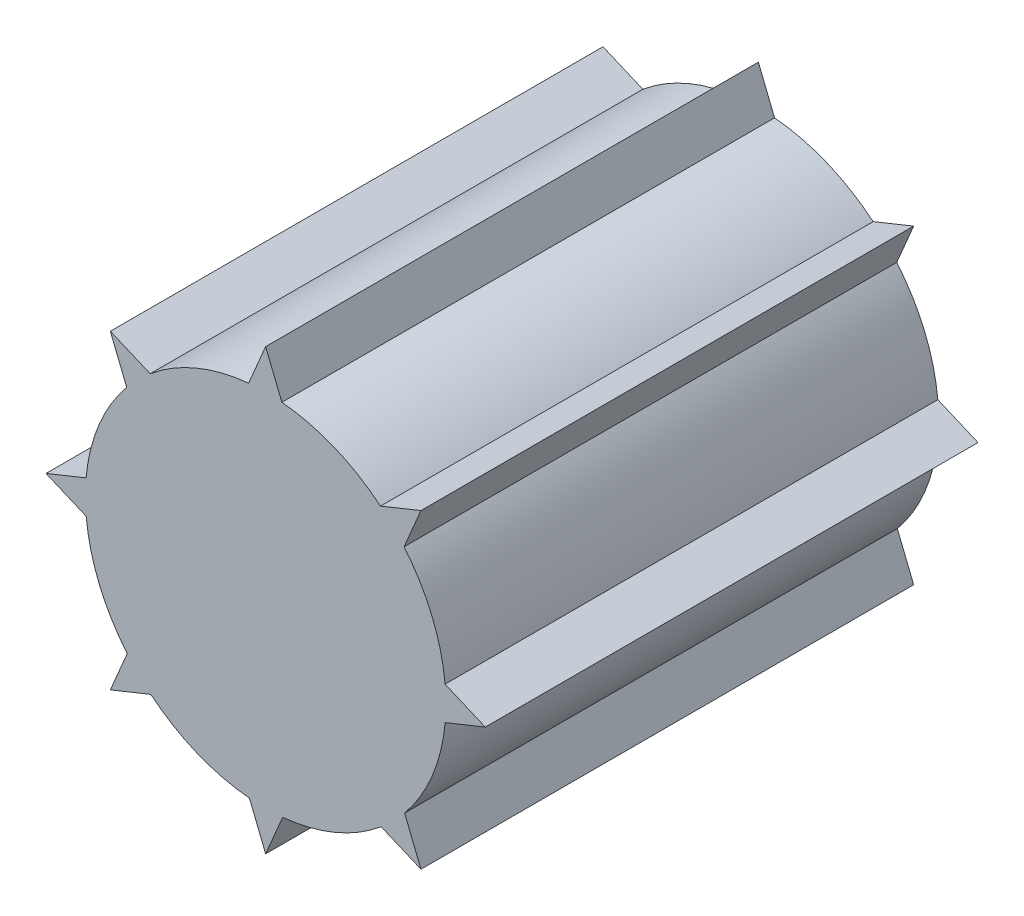
ISO-10303-21;
HEADER;
FILE_DESCRIPTION(('STEP AP214'),'2;1');
FILE_NAME('part.step','',(''),(''),'','','');
FILE_SCHEMA(('AUTOMOTIVE_DESIGN { 1 0 10303 214 1 1 1 1 }'));
ENDSEC;
DATA;
#1=APPLICATION_CONTEXT('core data for automotive mechanical design processes');
#2=APPLICATION_PROTOCOL_DEFINITION('international standard','automotive_design',2000,#1);
#3=PRODUCT_CONTEXT('',#1,'mechanical');
#4=PRODUCT('Part','Part','',(#3));
#5=PRODUCT_RELATED_PRODUCT_CATEGORY('part','',(#4));
#6=PRODUCT_DEFINITION_FORMATION('','',#4);
#7=PRODUCT_DEFINITION_CONTEXT('part definition',#1,'design');
#8=PRODUCT_DEFINITION('design','',#6,#7);
#9=PRODUCT_DEFINITION_SHAPE('','',#8);
#10=(LENGTH_UNIT() NAMED_UNIT(*) SI_UNIT(.MILLI.,.METRE.));
#11=(NAMED_UNIT(*) PLANE_ANGLE_UNIT() SI_UNIT($,.RADIAN.));
#12=(NAMED_UNIT(*) SI_UNIT($,.STERADIAN.) SOLID_ANGLE_UNIT());
#13=UNCERTAINTY_MEASURE_WITH_UNIT(LENGTH_MEASURE(1.E-05),#10,'distance_accuracy_value','');
#14=(GEOMETRIC_REPRESENTATION_CONTEXT(3) GLOBAL_UNCERTAINTY_ASSIGNED_CONTEXT((#13)) GLOBAL_UNIT_ASSIGNED_CONTEXT((#10,
#11,#12)) REPRESENTATION_CONTEXT('',''));
#15=CARTESIAN_POINT('',(0.,0.,0.));
#16=DIRECTION('',(0.,0.,1.));
#17=DIRECTION('',(1.,0.,0.));
#18=AXIS2_PLACEMENT_3D('',#15,#16,#17);
#19=CARTESIAN_POINT('',(0.,0.,85.));
#20=DIRECTION('',(0.,0.,-1.));
#21=DIRECTION('',(-1.,0.,0.));
#22=AXIS2_PLACEMENT_3D('',#19,#20,#21);
#23=CYLINDRICAL_SURFACE('',#22,31.0975229357791);
#24=CARTESIAN_POINT('',(0.,0.,0.));
#25=DIRECTION('',(0.,0.,1.));
#26=DIRECTION('',(1.,0.,0.));
#27=AXIS2_PLACEMENT_3D('',#24,#25,#26);
#28=CIRCLE('',#27,31.0975229357791);
#29=CARTESIAN_POINT('',(-2.94038358851622,30.9581988670803,0.));
#30=VERTEX_POINT('',#29);
#31=CARTESIAN_POINT('',(-19.9210625112819,23.8790117291923,0.));
#32=VERTEX_POINT('',#31);
#33=EDGE_CURVE('E225',#30,#32,#28,.T.);
#34=ORIENTED_EDGE('',*,*,#33,.T.);
#35=DIRECTION('',(0.,0.,-1.));
#36=VECTOR('',#35,1.);
#37=CARTESIAN_POINT('',(-19.9210625112819,23.8790117291923,85.));
#38=LINE('',#37,#36);
#39=CARTESIAN_POINT('',(-19.9210625112819,23.8790117291923,85.));
#40=VERTEX_POINT('',#39);
#41=EDGE_CURVE('E11',#40,#32,#38,.T.);
#42=ORIENTED_EDGE('',*,*,#41,.F.);
#43=CARTESIAN_POINT('',(0.,0.,85.));
#44=DIRECTION('',(0.,0.,1.));
#45=DIRECTION('',(1.,0.,0.));
#46=AXIS2_PLACEMENT_3D('',#43,#44,#45);
#47=CIRCLE('',#46,31.0975229357791);
#48=CARTESIAN_POINT('',(-2.94038358851622,30.9581988670803,85.));
#49=VERTEX_POINT('',#48);
#50=EDGE_CURVE('E271',#49,#40,#47,.T.);
#51=ORIENTED_EDGE('',*,*,#50,.F.);
#52=DIRECTION('',(0.,0.,-1.));
#53=VECTOR('',#52,1.);
#54=CARTESIAN_POINT('',(-2.94038358851622,30.9581988670803,85.));
#55=LINE('',#54,#53);
#56=EDGE_CURVE('E221',#49,#30,#55,.T.);
#57=ORIENTED_EDGE('',*,*,#56,.T.);
#58=EDGE_LOOP('',(#34,#42,#51,#57));
#59=FACE_BOUND('',#58,.T.);
#60=ADVANCED_FACE('F33',(#59),#23,.T.);
#61=CARTESIAN_POINT('',(-26.7934881803067,26.7934881803069,85.));
#62=DIRECTION('',(-0.390425181277966,-0.920634660342564,0.));
#63=DIRECTION('',(0.920634660342564,-0.390425181277966,0.));
#64=AXIS2_PLACEMENT_3D('',#61,#62,#63);
#65=PLANE('',#64);
#66=DIRECTION('',(-0.920634660342564,0.390425181277965,0.));
#67=VECTOR('',#66,1.);
#68=CARTESIAN_POINT('',(-26.7934881803067,26.7934881803069,0.));
#69=LINE('',#68,#67);
#70=CARTESIAN_POINT('',(-26.7934881803067,26.7934881803069,0.));
#71=VERTEX_POINT('',#70);
#72=EDGE_CURVE('E228',#32,#71,#69,.T.);
#73=ORIENTED_EDGE('',*,*,#72,.T.);
#74=DIRECTION('',(0.,0.,-1.));
#75=VECTOR('',#74,1.);
#76=CARTESIAN_POINT('',(-26.7934881803067,26.7934881803069,85.));
#77=LINE('',#76,#75);
#78=CARTESIAN_POINT('',(-26.7934881803067,26.7934881803069,85.));
#79=VERTEX_POINT('',#78);
#80=EDGE_CURVE('E41',#79,#71,#77,.T.);
#81=ORIENTED_EDGE('',*,*,#80,.F.);
#82=DIRECTION('',(-0.920634660342564,0.390425181277965,0.));
#83=VECTOR('',#82,1.);
#84=CARTESIAN_POINT('',(-26.7934881803067,26.7934881803069,85.));
#85=LINE('',#84,#83);
#86=EDGE_CURVE('E140',#40,#79,#85,.T.);
#87=ORIENTED_EDGE('',*,*,#86,.F.);
#88=ORIENTED_EDGE('',*,*,#41,.T.);
#89=EDGE_LOOP('',(#73,#81,#87,#88));
#90=FACE_BOUND('',#89,.T.);
#91=ADVANCED_FACE('F409',(#90),#65,.F.);
#92=CARTESIAN_POINT('',(-23.9699175269631,19.8115871775043,85.));
#93=DIRECTION('',(0.927059304551223,0.374914718096,0.));
#94=DIRECTION('',(-0.374914718096,0.927059304551223,0.));
#95=AXIS2_PLACEMENT_3D('',#92,#93,#94);
#96=PLANE('',#95);
#97=DIRECTION('',(0.374914718096,-0.927059304551223,0.));
#98=VECTOR('',#97,1.);
#99=CARTESIAN_POINT('',(-23.9699175269631,19.8115871775043,0.));
#100=LINE('',#99,#98);
#101=CARTESIAN_POINT('',(-23.9699175269634,19.8115871775045,0.));
#102=VERTEX_POINT('',#101);
#103=EDGE_CURVE('E230',#71,#102,#100,.T.);
#104=ORIENTED_EDGE('',*,*,#103,.T.);
#105=DIRECTION('',(0.,0.,-1.));
#106=VECTOR('',#105,1.);
#107=CARTESIAN_POINT('',(-23.9699175269634,19.8115871775045,85.));
#108=LINE('',#107,#106);
#109=CARTESIAN_POINT('',(-23.9699175269634,19.8115871775045,85.));
#110=VERTEX_POINT('',#109);
#111=EDGE_CURVE('E326',#110,#102,#108,.T.);
#112=ORIENTED_EDGE('',*,*,#111,.F.);
#113=DIRECTION('',(0.374914718096,-0.927059304551223,0.));
#114=VECTOR('',#113,1.);
#115=CARTESIAN_POINT('',(-23.9699175269631,19.8115871775043,85.));
#116=LINE('',#115,#114);
#117=EDGE_CURVE('E334',#79,#110,#116,.T.);
#118=ORIENTED_EDGE('',*,*,#117,.F.);
#119=ORIENTED_EDGE('',*,*,#80,.T.);
#120=EDGE_LOOP('',(#104,#112,#118,#119));
#121=FACE_BOUND('',#120,.T.);
#122=ADVANCED_FACE('F332',(#121),#96,.F.);
#123=CARTESIAN_POINT('',(0.,0.,85.));
#124=DIRECTION('',(0.,0.,-1.));
#125=DIRECTION('',(-1.,0.,0.));
#126=AXIS2_PLACEMENT_3D('',#123,#124,#125);
#127=CYLINDRICAL_SURFACE('',#126,31.0975229357787);
#128=CARTESIAN_POINT('',(0.,0.,0.));
#129=DIRECTION('',(0.,0.,1.));
#130=DIRECTION('',(1.,0.,0.));
#131=AXIS2_PLACEMENT_3D('',#128,#129,#130);
#132=CIRCLE('',#131,31.0975229357787);
#133=CARTESIAN_POINT('',(-30.9713295119135,2.79869273157637,0.));
#134=VERTEX_POINT('',#133);
#135=EDGE_CURVE('E232',#102,#134,#132,.T.);
#136=ORIENTED_EDGE('',*,*,#135,.T.);
#137=DIRECTION('',(0.,0.,-1.));
#138=VECTOR('',#137,1.);
#139=CARTESIAN_POINT('',(-30.9713295119135,2.79869273157637,85.));
#140=LINE('',#139,#138);
#141=CARTESIAN_POINT('',(-30.9713295119135,2.79869273157637,85.));
#142=VERTEX_POINT('',#141);
#143=EDGE_CURVE('E323',#142,#134,#140,.T.);
#144=ORIENTED_EDGE('',*,*,#143,.F.);
#145=CARTESIAN_POINT('',(0.,0.,85.));
#146=DIRECTION('',(0.,0.,1.));
#147=DIRECTION('',(1.,0.,0.));
#148=AXIS2_PLACEMENT_3D('',#145,#146,#147);
#149=CIRCLE('',#148,31.0975229357787);
#150=EDGE_CURVE('E352',#110,#142,#149,.T.);
#151=ORIENTED_EDGE('',*,*,#150,.F.);
#152=ORIENTED_EDGE('',*,*,#111,.T.);
#153=EDGE_LOOP('',(#136,#144,#151,#152));
#154=FACE_BOUND('',#153,.T.);
#155=ADVANCED_FACE('F343',(#154),#127,.T.);
#156=CARTESIAN_POINT('',(-37.8917143678731,1.54140154907481E-13,85.));
#157=DIRECTION('',(0.374914718095965,-0.927059304551237,0.));
#158=DIRECTION('',(0.927059304551237,0.374914718095965,0.));
#159=AXIS2_PLACEMENT_3D('',#156,#157,#158);
#160=PLANE('',#159);
#161=DIRECTION('',(-0.927059304551237,-0.374914718095965,0.));
#162=VECTOR('',#161,1.);
#163=CARTESIAN_POINT('',(-37.8917143678731,1.54140154907481E-13,0.));
#164=LINE('',#163,#162);
#165=CARTESIAN_POINT('',(-37.8917143678731,1.54140154907481E-13,0.));
#166=VERTEX_POINT('',#165);
#167=EDGE_CURVE('E234',#134,#166,#164,.T.);
#168=ORIENTED_EDGE('',*,*,#167,.T.);
#169=DIRECTION('',(0.,0.,-1.));
#170=VECTOR('',#169,1.);
#171=CARTESIAN_POINT('',(-37.8917143678731,1.54140154907481E-13,85.));
#172=LINE('',#171,#170);
#173=CARTESIAN_POINT('',(-37.8917143678731,1.54140154907481E-13,85.));
#174=VERTEX_POINT('',#173);
#175=EDGE_CURVE('E320',#174,#166,#172,.T.);
#176=ORIENTED_EDGE('',*,*,#175,.F.);
#177=DIRECTION('',(-0.927059304551237,-0.374914718095965,0.));
#178=VECTOR('',#177,1.);
#179=CARTESIAN_POINT('',(-37.8917143678731,1.54140154907481E-13,85.));
#180=LINE('',#179,#178);
#181=EDGE_CURVE('E349',#142,#174,#180,.T.);
#182=ORIENTED_EDGE('',*,*,#181,.F.);
#183=ORIENTED_EDGE('',*,*,#143,.T.);
#184=EDGE_LOOP('',(#168,#176,#182,#183));
#185=FACE_BOUND('',#184,.T.);
#186=ADVANCED_FACE('F347',(#185),#160,.F.);
#187=CARTESIAN_POINT('',(-30.9581988670803,-2.94038358851622,85.));
#188=DIRECTION('',(0.390425181277966,0.920634660342563,0.));
#189=DIRECTION('',(-0.920634660342564,0.390425181277966,0.));
#190=AXIS2_PLACEMENT_3D('',#187,#188,#189);
#191=PLANE('',#190);
#192=DIRECTION('',(0.920634660342564,-0.390425181277966,0.));
#193=VECTOR('',#192,1.);
#194=CARTESIAN_POINT('',(-30.9581988670803,-2.94038358851622,0.));
#195=LINE('',#194,#193);
#196=CARTESIAN_POINT('',(-30.9581988670803,-2.94038358851622,0.));
#197=VERTEX_POINT('',#196);
#198=EDGE_CURVE('E236',#166,#197,#195,.T.);
#199=ORIENTED_EDGE('',*,*,#198,.T.);
#200=DIRECTION('',(0.,0.,-1.));
#201=VECTOR('',#200,1.);
#202=CARTESIAN_POINT('',(-30.9581988670803,-2.94038358851622,85.));
#203=LINE('',#202,#201);
#204=CARTESIAN_POINT('',(-30.9581988670803,-2.94038358851622,85.));
#205=VERTEX_POINT('',#204);
#206=EDGE_CURVE('E317',#205,#197,#203,.T.);
#207=ORIENTED_EDGE('',*,*,#206,.F.);
#208=DIRECTION('',(0.920634660342564,-0.390425181277966,0.));
#209=VECTOR('',#208,1.);
#210=CARTESIAN_POINT('',(-30.9581988670803,-2.94038358851622,85.));
#211=LINE('',#210,#209);
#212=EDGE_CURVE('E351',#174,#205,#211,.T.);
#213=ORIENTED_EDGE('',*,*,#212,.F.);
#214=ORIENTED_EDGE('',*,*,#175,.T.);
#215=EDGE_LOOP('',(#199,#207,#213,#214));
#216=FACE_BOUND('',#215,.T.);
#217=ADVANCED_FACE('F422',(#216),#191,.F.);
#218=CARTESIAN_POINT('',(0.,0.,85.));
#219=DIRECTION('',(0.,0.,-1.));
#220=DIRECTION('',(-1.,0.,0.));
#221=AXIS2_PLACEMENT_3D('',#218,#219,#220);
#222=CYLINDRICAL_SURFACE('',#221,31.0975229357791);
#223=CARTESIAN_POINT('',(0.,0.,0.));
#224=DIRECTION('',(0.,0.,1.));
#225=DIRECTION('',(1.,0.,0.));
#226=AXIS2_PLACEMENT_3D('',#223,#224,#225);
#227=CIRCLE('',#226,31.0975229357791);
#228=CARTESIAN_POINT('',(-23.8790117291923,-19.9210625112819,0.));
#229=VERTEX_POINT('',#228);
#230=EDGE_CURVE('E238',#197,#229,#227,.T.);
#231=ORIENTED_EDGE('',*,*,#230,.T.);
#232=DIRECTION('',(0.,0.,-1.));
#233=VECTOR('',#232,1.);
#234=CARTESIAN_POINT('',(-23.8790117291923,-19.9210625112819,85.));
#235=LINE('',#234,#233);
#236=CARTESIAN_POINT('',(-23.8790117291923,-19.9210625112819,85.));
#237=VERTEX_POINT('',#236);
#238=EDGE_CURVE('E314',#237,#229,#235,.T.);
#239=ORIENTED_EDGE('',*,*,#238,.F.);
#240=CARTESIAN_POINT('',(0.,0.,85.));
#241=DIRECTION('',(0.,0.,1.));
#242=DIRECTION('',(1.,0.,0.));
#243=AXIS2_PLACEMENT_3D('',#240,#241,#242);
#244=CIRCLE('',#243,31.0975229357791);
#245=EDGE_CURVE('E354',#205,#237,#244,.T.);
#246=ORIENTED_EDGE('',*,*,#245,.F.);
#247=ORIENTED_EDGE('',*,*,#206,.T.);
#248=EDGE_LOOP('',(#231,#239,#246,#247));
#249=FACE_BOUND('',#248,.T.);
#250=ADVANCED_FACE('F425',(#249),#222,.T.);
#251=CARTESIAN_POINT('',(-26.7934881803069,-26.7934881803067,85.));
#252=DIRECTION('',(0.920634660342564,-0.390425181277965,0.));
#253=DIRECTION('',(0.390425181277965,0.920634660342564,0.));
#254=AXIS2_PLACEMENT_3D('',#251,#252,#253);
#255=PLANE('',#254);
#256=DIRECTION('',(-0.390425181277965,-0.920634660342564,0.));
#257=VECTOR('',#256,1.);
#258=CARTESIAN_POINT('',(-26.7934881803069,-26.7934881803067,0.));
#259=LINE('',#258,#257);
#260=CARTESIAN_POINT('',(-26.7934881803069,-26.7934881803067,0.));
#261=VERTEX_POINT('',#260);
#262=EDGE_CURVE('E240',#229,#261,#259,.T.);
#263=ORIENTED_EDGE('',*,*,#262,.T.);
#264=DIRECTION('',(0.,0.,-1.));
#265=VECTOR('',#264,1.);
#266=CARTESIAN_POINT('',(-26.7934881803069,-26.7934881803067,85.));
#267=LINE('',#266,#265);
#268=CARTESIAN_POINT('',(-26.7934881803069,-26.7934881803067,85.));
#269=VERTEX_POINT('',#268);
#270=EDGE_CURVE('E311',#269,#261,#267,.T.);
#271=ORIENTED_EDGE('',*,*,#270,.F.);
#272=DIRECTION('',(-0.390425181277965,-0.920634660342564,0.));
#273=VECTOR('',#272,1.);
#274=CARTESIAN_POINT('',(-26.7934881803069,-26.7934881803067,85.));
#275=LINE('',#274,#273);
#276=EDGE_CURVE('E360',#237,#269,#275,.T.);
#277=ORIENTED_EDGE('',*,*,#276,.F.);
#278=ORIENTED_EDGE('',*,*,#238,.T.);
#279=EDGE_LOOP('',(#263,#271,#277,#278));
#280=FACE_BOUND('',#279,.T.);
#281=ADVANCED_FACE('F429',(#280),#255,.F.);
#282=CARTESIAN_POINT('',(-19.8115871775047,-23.9699175269636,85.));
#283=DIRECTION('',(-0.374914718095964,0.927059304551237,0.));
#284=DIRECTION('',(-0.927059304551238,-0.374914718095964,0.));
#285=AXIS2_PLACEMENT_3D('',#282,#283,#284);
#286=PLANE('',#285);
#287=DIRECTION('',(0.927059304551237,0.374914718095964,0.));
#288=VECTOR('',#287,1.);
#289=CARTESIAN_POINT('',(-19.8115871775047,-23.9699175269636,0.));
#290=LINE('',#289,#288);
#291=CARTESIAN_POINT('',(-19.8115871775047,-23.9699175269636,0.));
#292=VERTEX_POINT('',#291);
#293=EDGE_CURVE('E242',#261,#292,#290,.T.);
#294=ORIENTED_EDGE('',*,*,#293,.T.);
#295=DIRECTION('',(0.,0.,-1.));
#296=VECTOR('',#295,1.);
#297=CARTESIAN_POINT('',(-19.8115871775047,-23.9699175269636,85.));
#298=LINE('',#297,#296);
#299=CARTESIAN_POINT('',(-19.8115871775047,-23.9699175269636,85.));
#300=VERTEX_POINT('',#299);
#301=EDGE_CURVE('E308',#300,#292,#298,.T.);
#302=ORIENTED_EDGE('',*,*,#301,.F.);
#303=DIRECTION('',(0.927059304551237,0.374914718095964,0.));
#304=VECTOR('',#303,1.);
#305=CARTESIAN_POINT('',(-19.8115871775047,-23.9699175269636,85.));
#306=LINE('',#305,#304);
#307=EDGE_CURVE('E362',#269,#300,#306,.T.);
#308=ORIENTED_EDGE('',*,*,#307,.F.);
#309=ORIENTED_EDGE('',*,*,#270,.T.);
#310=EDGE_LOOP('',(#294,#302,#308,#309));
#311=FACE_BOUND('',#310,.T.);
#312=ADVANCED_FACE('F433',(#311),#286,.F.);
#313=CARTESIAN_POINT('',(0.,0.,85.));
#314=DIRECTION('',(0.,0.,-1.));
#315=DIRECTION('',(-1.,0.,0.));
#316=AXIS2_PLACEMENT_3D('',#313,#314,#315);
#317=CYLINDRICAL_SURFACE('',#316,31.0975229357791);
#318=CARTESIAN_POINT('',(0.,0.,0.));
#319=DIRECTION('',(0.,0.,1.));
#320=DIRECTION('',(1.,0.,0.));
#321=AXIS2_PLACEMENT_3D('',#318,#319,#320);
#322=CIRCLE('',#321,31.0975229357791);
#323=CARTESIAN_POINT('',(-2.79869273157637,-30.9713295119135,0.));
#324=VERTEX_POINT('',#323);
#325=EDGE_CURVE('E244',#292,#324,#322,.T.);
#326=ORIENTED_EDGE('',*,*,#325,.T.);
#327=DIRECTION('',(0.,0.,-1.));
#328=VECTOR('',#327,1.);
#329=CARTESIAN_POINT('',(-2.79869273157637,-30.9713295119135,85.));
#330=LINE('',#329,#328);
#331=CARTESIAN_POINT('',(-2.79869273157637,-30.9713295119135,85.));
#332=VERTEX_POINT('',#331);
#333=EDGE_CURVE('E305',#332,#324,#330,.T.);
#334=ORIENTED_EDGE('',*,*,#333,.F.);
#335=CARTESIAN_POINT('',(0.,0.,85.));
#336=DIRECTION('',(0.,0.,1.));
#337=DIRECTION('',(1.,0.,0.));
#338=AXIS2_PLACEMENT_3D('',#335,#336,#337);
#339=CIRCLE('',#338,31.0975229357791);
#340=EDGE_CURVE('E364',#300,#332,#339,.T.);
#341=ORIENTED_EDGE('',*,*,#340,.F.);
#342=ORIENTED_EDGE('',*,*,#301,.T.);
#343=EDGE_LOOP('',(#326,#334,#341,#342));
#344=FACE_BOUND('',#343,.T.);
#345=ADVANCED_FACE('F437',(#344),#317,.T.);
#346=CARTESIAN_POINT('',(-1.56460353243222E-13,-37.8917143678731,85.));
#347=DIRECTION('',(0.927059304551237,0.374914718095964,0.));
#348=DIRECTION('',(-0.374914718095964,0.927059304551237,0.));
#349=AXIS2_PLACEMENT_3D('',#346,#347,#348);
#350=PLANE('',#349);
#351=DIRECTION('',(0.374914718095964,-0.927059304551237,0.));
#352=VECTOR('',#351,1.);
#353=CARTESIAN_POINT('',(-1.56460353243222E-13,-37.8917143678731,0.));
#354=LINE('',#353,#352);
#355=CARTESIAN_POINT('',(-1.56460353243222E-13,-37.8917143678731,0.));
#356=VERTEX_POINT('',#355);
#357=EDGE_CURVE('E246',#324,#356,#354,.T.);
#358=ORIENTED_EDGE('',*,*,#357,.T.);
#359=DIRECTION('',(0.,0.,-1.));
#360=VECTOR('',#359,1.);
#361=CARTESIAN_POINT('',(-1.56460353243222E-13,-37.8917143678731,85.));
#362=LINE('',#361,#360);
#363=CARTESIAN_POINT('',(-1.56460353243222E-13,-37.8917143678731,85.));
#364=VERTEX_POINT('',#363);
#365=EDGE_CURVE('E302',#364,#356,#362,.T.);
#366=ORIENTED_EDGE('',*,*,#365,.F.);
#367=DIRECTION('',(0.374914718095964,-0.927059304551237,0.));
#368=VECTOR('',#367,1.);
#369=CARTESIAN_POINT('',(-1.56460353243222E-13,-37.8917143678731,85.));
#370=LINE('',#369,#368);
#371=EDGE_CURVE('E366',#332,#364,#370,.T.);
#372=ORIENTED_EDGE('',*,*,#371,.F.);
#373=ORIENTED_EDGE('',*,*,#333,.T.);
#374=EDGE_LOOP('',(#358,#366,#372,#373));
#375=FACE_BOUND('',#374,.T.);
#376=ADVANCED_FACE('F441',(#375),#350,.F.);
#377=CARTESIAN_POINT('',(2.94038358851622,-30.9581988670803,85.));
#378=DIRECTION('',(-0.920634660342563,0.390425181277966,0.));
#379=DIRECTION('',(-0.390425181277966,-0.920634660342564,0.));
#380=AXIS2_PLACEMENT_3D('',#377,#378,#379);
#381=PLANE('',#380);
#382=DIRECTION('',(0.390425181277966,0.920634660342564,0.));
#383=VECTOR('',#382,1.);
#384=CARTESIAN_POINT('',(2.94038358851622,-30.9581988670803,0.));
#385=LINE('',#384,#383);
#386=CARTESIAN_POINT('',(2.9403835885162,-30.9581988670803,0.));
#387=VERTEX_POINT('',#386);
#388=EDGE_CURVE('E248',#356,#387,#385,.T.);
#389=ORIENTED_EDGE('',*,*,#388,.T.);
#390=DIRECTION('',(0.,0.,-1.));
#391=VECTOR('',#390,1.);
#392=CARTESIAN_POINT('',(2.9403835885162,-30.9581988670803,85.));
#393=LINE('',#392,#391);
#394=CARTESIAN_POINT('',(2.9403835885162,-30.9581988670803,85.));
#395=VERTEX_POINT('',#394);
#396=EDGE_CURVE('E299',#395,#387,#393,.T.);
#397=ORIENTED_EDGE('',*,*,#396,.F.);
#398=DIRECTION('',(0.390425181277966,0.920634660342564,0.));
#399=VECTOR('',#398,1.);
#400=CARTESIAN_POINT('',(2.94038358851622,-30.9581988670803,85.));
#401=LINE('',#400,#399);
#402=EDGE_CURVE('E368',#364,#395,#401,.T.);
#403=ORIENTED_EDGE('',*,*,#402,.F.);
#404=ORIENTED_EDGE('',*,*,#365,.T.);
#405=EDGE_LOOP('',(#389,#397,#403,#404));
#406=FACE_BOUND('',#405,.T.);
#407=ADVANCED_FACE('F445',(#406),#381,.F.);
#408=CARTESIAN_POINT('',(0.,0.,85.));
#409=DIRECTION('',(0.,0.,-1.));
#410=DIRECTION('',(-1.,0.,0.));
#411=AXIS2_PLACEMENT_3D('',#408,#409,#410);
#412=CYLINDRICAL_SURFACE('',#411,31.0975229357791);
#413=CARTESIAN_POINT('',(0.,0.,0.));
#414=DIRECTION('',(0.,0.,1.));
#415=DIRECTION('',(1.,0.,0.));
#416=AXIS2_PLACEMENT_3D('',#413,#414,#415);
#417=CIRCLE('',#416,31.0975229357791);
#418=CARTESIAN_POINT('',(19.9210625112819,-23.8790117291923,0.));
#419=VERTEX_POINT('',#418);
#420=EDGE_CURVE('E250',#387,#419,#417,.T.);
#421=ORIENTED_EDGE('',*,*,#420,.T.);
#422=DIRECTION('',(0.,0.,-1.));
#423=VECTOR('',#422,1.);
#424=CARTESIAN_POINT('',(19.9210625112819,-23.8790117291923,85.));
#425=LINE('',#424,#423);
#426=CARTESIAN_POINT('',(19.9210625112819,-23.8790117291923,85.));
#427=VERTEX_POINT('',#426);
#428=EDGE_CURVE('E296',#427,#419,#425,.T.);
#429=ORIENTED_EDGE('',*,*,#428,.F.);
#430=CARTESIAN_POINT('',(0.,0.,85.));
#431=DIRECTION('',(0.,0.,1.));
#432=DIRECTION('',(1.,0.,0.));
#433=AXIS2_PLACEMENT_3D('',#430,#431,#432);
#434=CIRCLE('',#433,31.0975229357791);
#435=EDGE_CURVE('E370',#395,#427,#434,.T.);
#436=ORIENTED_EDGE('',*,*,#435,.F.);
#437=ORIENTED_EDGE('',*,*,#396,.T.);
#438=EDGE_LOOP('',(#421,#429,#436,#437));
#439=FACE_BOUND('',#438,.T.);
#440=ADVANCED_FACE('F449',(#439),#412,.T.);
#441=CARTESIAN_POINT('',(26.7934881803067,-26.7934881803069,85.));
#442=DIRECTION('',(0.390425181277965,0.920634660342564,0.));
#443=DIRECTION('',(-0.920634660342564,0.390425181277965,0.));
#444=AXIS2_PLACEMENT_3D('',#441,#442,#443);
#445=PLANE('',#444);
#446=DIRECTION('',(0.920634660342564,-0.390425181277965,0.));
#447=VECTOR('',#446,1.);
#448=CARTESIAN_POINT('',(26.7934881803067,-26.7934881803069,0.));
#449=LINE('',#448,#447);
#450=CARTESIAN_POINT('',(26.7934881803067,-26.7934881803069,0.));
#451=VERTEX_POINT('',#450);
#452=EDGE_CURVE('E252',#419,#451,#449,.T.);
#453=ORIENTED_EDGE('',*,*,#452,.T.);
#454=DIRECTION('',(0.,0.,-1.));
#455=VECTOR('',#454,1.);
#456=CARTESIAN_POINT('',(26.7934881803067,-26.7934881803069,85.));
#457=LINE('',#456,#455);
#458=CARTESIAN_POINT('',(26.7934881803067,-26.7934881803069,85.));
#459=VERTEX_POINT('',#458);
#460=EDGE_CURVE('E293',#459,#451,#457,.T.);
#461=ORIENTED_EDGE('',*,*,#460,.F.);
#462=DIRECTION('',(0.920634660342564,-0.390425181277965,0.));
#463=VECTOR('',#462,1.);
#464=CARTESIAN_POINT('',(26.7934881803067,-26.7934881803069,85.));
#465=LINE('',#464,#463);
#466=EDGE_CURVE('E372',#427,#459,#465,.T.);
#467=ORIENTED_EDGE('',*,*,#466,.F.);
#468=ORIENTED_EDGE('',*,*,#428,.T.);
#469=EDGE_LOOP('',(#453,#461,#467,#468));
#470=FACE_BOUND('',#469,.T.);
#471=ADVANCED_FACE('F453',(#470),#445,.F.);
#472=CARTESIAN_POINT('',(23.9699175269636,-19.8115871775047,85.));
#473=DIRECTION('',(-0.927059304551237,-0.374914718095963,0.));
#474=DIRECTION('',(0.374914718095963,-0.927059304551238,0.));
#475=AXIS2_PLACEMENT_3D('',#472,#473,#474);
#476=PLANE('',#475);
#477=DIRECTION('',(-0.374914718095963,0.927059304551238,0.));
#478=VECTOR('',#477,1.);
#479=CARTESIAN_POINT('',(23.9699175269636,-19.8115871775047,0.));
#480=LINE('',#479,#478);
#481=CARTESIAN_POINT('',(23.9699175269636,-19.8115871775047,0.));
#482=VERTEX_POINT('',#481);
#483=EDGE_CURVE('E254',#451,#482,#480,.T.);
#484=ORIENTED_EDGE('',*,*,#483,.T.);
#485=DIRECTION('',(0.,0.,-1.));
#486=VECTOR('',#485,1.);
#487=CARTESIAN_POINT('',(23.9699175269636,-19.8115871775047,85.));
#488=LINE('',#487,#486);
#489=CARTESIAN_POINT('',(23.9699175269636,-19.8115871775047,85.));
#490=VERTEX_POINT('',#489);
#491=EDGE_CURVE('E290',#490,#482,#488,.T.);
#492=ORIENTED_EDGE('',*,*,#491,.F.);
#493=DIRECTION('',(-0.374914718095963,0.927059304551238,0.));
#494=VECTOR('',#493,1.);
#495=CARTESIAN_POINT('',(23.9699175269636,-19.8115871775047,85.));
#496=LINE('',#495,#494);
#497=EDGE_CURVE('E374',#459,#490,#496,.T.);
#498=ORIENTED_EDGE('',*,*,#497,.F.);
#499=ORIENTED_EDGE('',*,*,#460,.T.);
#500=EDGE_LOOP('',(#484,#492,#498,#499));
#501=FACE_BOUND('',#500,.T.);
#502=ADVANCED_FACE('F457',(#501),#476,.F.);
#503=CARTESIAN_POINT('',(0.,0.,85.));
#504=DIRECTION('',(0.,0.,-1.));
#505=DIRECTION('',(-1.,0.,0.));
#506=AXIS2_PLACEMENT_3D('',#503,#504,#505);
#507=CYLINDRICAL_SURFACE('',#506,31.0975229357791);
#508=CARTESIAN_POINT('',(0.,0.,0.));
#509=DIRECTION('',(0.,0.,1.));
#510=DIRECTION('',(1.,0.,0.));
#511=AXIS2_PLACEMENT_3D('',#508,#509,#510);
#512=CIRCLE('',#511,31.0975229357791);
#513=CARTESIAN_POINT('',(30.9713295119135,-2.79869273157638,0.));
#514=VERTEX_POINT('',#513);
#515=EDGE_CURVE('E256',#482,#514,#512,.T.);
#516=ORIENTED_EDGE('',*,*,#515,.T.);
#517=DIRECTION('',(0.,0.,-1.));
#518=VECTOR('',#517,1.);
#519=CARTESIAN_POINT('',(30.9713295119135,-2.79869273157638,85.));
#520=LINE('',#519,#518);
#521=CARTESIAN_POINT('',(30.9713295119135,-2.79869273157638,85.));
#522=VERTEX_POINT('',#521);
#523=EDGE_CURVE('E287',#522,#514,#520,.T.);
#524=ORIENTED_EDGE('',*,*,#523,.F.);
#525=CARTESIAN_POINT('',(0.,0.,85.));
#526=DIRECTION('',(0.,0.,1.));
#527=DIRECTION('',(1.,0.,0.));
#528=AXIS2_PLACEMENT_3D('',#525,#526,#527);
#529=CIRCLE('',#528,31.0975229357791);
#530=EDGE_CURVE('E376',#490,#522,#529,.T.);
#531=ORIENTED_EDGE('',*,*,#530,.F.);
#532=ORIENTED_EDGE('',*,*,#491,.T.);
#533=EDGE_LOOP('',(#516,#524,#531,#532));
#534=FACE_BOUND('',#533,.T.);
#535=ADVANCED_FACE('F461',(#534),#507,.T.);
#536=CARTESIAN_POINT('',(37.8917143678731,-1.58780551578963E-13,85.));
#537=DIRECTION('',(-0.374914718095964,0.927059304551237,0.));
#538=DIRECTION('',(-0.927059304551237,-0.374914718095964,0.));
#539=AXIS2_PLACEMENT_3D('',#536,#537,#538);
#540=PLANE('',#539);
#541=DIRECTION('',(0.927059304551237,0.374914718095964,0.));
#542=VECTOR('',#541,1.);
#543=CARTESIAN_POINT('',(37.8917143678731,-1.58780551578963E-13,0.));
#544=LINE('',#543,#542);
#545=CARTESIAN_POINT('',(37.8917143678731,-1.58780551578963E-13,0.));
#546=VERTEX_POINT('',#545);
#547=EDGE_CURVE('E258',#514,#546,#544,.T.);
#548=ORIENTED_EDGE('',*,*,#547,.T.);
#549=DIRECTION('',(0.,0.,-1.));
#550=VECTOR('',#549,1.);
#551=CARTESIAN_POINT('',(37.8917143678731,-1.58780551578963E-13,85.));
#552=LINE('',#551,#550);
#553=CARTESIAN_POINT('',(37.8917143678731,-1.58780551578963E-13,85.));
#554=VERTEX_POINT('',#553);
#555=EDGE_CURVE('E284',#554,#546,#552,.T.);
#556=ORIENTED_EDGE('',*,*,#555,.F.);
#557=DIRECTION('',(0.927059304551237,0.374914718095964,0.));
#558=VECTOR('',#557,1.);
#559=CARTESIAN_POINT('',(37.8917143678731,-1.58780551578963E-13,85.));
#560=LINE('',#559,#558);
#561=EDGE_CURVE('E378',#522,#554,#560,.T.);
#562=ORIENTED_EDGE('',*,*,#561,.F.);
#563=ORIENTED_EDGE('',*,*,#523,.T.);
#564=EDGE_LOOP('',(#548,#556,#562,#563));
#565=FACE_BOUND('',#564,.T.);
#566=ADVANCED_FACE('F465',(#565),#540,.F.);
#567=CARTESIAN_POINT('',(30.9581988670803,2.94038358851622,85.));
#568=DIRECTION('',(-0.390425181277966,-0.920634660342563,0.));
#569=DIRECTION('',(0.920634660342564,-0.390425181277966,0.));
#570=AXIS2_PLACEMENT_3D('',#567,#568,#569);
#571=PLANE('',#570);
#572=DIRECTION('',(-0.920634660342564,0.390425181277966,0.));
#573=VECTOR('',#572,1.);
#574=CARTESIAN_POINT('',(30.9581988670803,2.94038358851622,0.));
#575=LINE('',#574,#573);
#576=CARTESIAN_POINT('',(30.9581988670803,2.94038358851622,0.));
#577=VERTEX_POINT('',#576);
#578=EDGE_CURVE('E260',#546,#577,#575,.T.);
#579=ORIENTED_EDGE('',*,*,#578,.T.);
#580=DIRECTION('',(0.,0.,-1.));
#581=VECTOR('',#580,1.);
#582=CARTESIAN_POINT('',(30.9581988670803,2.94038358851622,85.));
#583=LINE('',#582,#581);
#584=CARTESIAN_POINT('',(30.9581988670803,2.94038358851622,85.));
#585=VERTEX_POINT('',#584);
#586=EDGE_CURVE('E281',#585,#577,#583,.T.);
#587=ORIENTED_EDGE('',*,*,#586,.F.);
#588=DIRECTION('',(-0.920634660342564,0.390425181277966,0.));
#589=VECTOR('',#588,1.);
#590=CARTESIAN_POINT('',(30.9581988670803,2.94038358851622,85.));
#591=LINE('',#590,#589);
#592=EDGE_CURVE('E380',#554,#585,#591,.T.);
#593=ORIENTED_EDGE('',*,*,#592,.F.);
#594=ORIENTED_EDGE('',*,*,#555,.T.);
#595=EDGE_LOOP('',(#579,#587,#593,#594));
#596=FACE_BOUND('',#595,.T.);
#597=ADVANCED_FACE('F469',(#596),#571,.F.);
#598=CARTESIAN_POINT('',(0.,0.,85.));
#599=DIRECTION('',(0.,0.,-1.));
#600=DIRECTION('',(-1.,0.,0.));
#601=AXIS2_PLACEMENT_3D('',#598,#599,#600);
#602=CYLINDRICAL_SURFACE('',#601,31.0975229357791);
#603=CARTESIAN_POINT('',(0.,0.,0.));
#604=DIRECTION('',(0.,0.,1.));
#605=DIRECTION('',(1.,0.,0.));
#606=AXIS2_PLACEMENT_3D('',#603,#604,#605);
#607=CIRCLE('',#606,31.0975229357791);
#608=CARTESIAN_POINT('',(23.8790117291923,19.9210625112819,0.));
#609=VERTEX_POINT('',#608);
#610=EDGE_CURVE('E262',#577,#609,#607,.T.);
#611=ORIENTED_EDGE('',*,*,#610,.T.);
#612=DIRECTION('',(0.,0.,-1.));
#613=VECTOR('',#612,1.);
#614=CARTESIAN_POINT('',(23.8790117291923,19.9210625112819,85.));
#615=LINE('',#614,#613);
#616=CARTESIAN_POINT('',(23.8790117291923,19.9210625112819,85.));
#617=VERTEX_POINT('',#616);
#618=EDGE_CURVE('E278',#617,#609,#615,.T.);
#619=ORIENTED_EDGE('',*,*,#618,.F.);
#620=CARTESIAN_POINT('',(0.,0.,85.));
#621=DIRECTION('',(0.,0.,1.));
#622=DIRECTION('',(1.,0.,0.));
#623=AXIS2_PLACEMENT_3D('',#620,#621,#622);
#624=CIRCLE('',#623,31.0975229357791);
#625=EDGE_CURVE('E382',#585,#617,#624,.T.);
#626=ORIENTED_EDGE('',*,*,#625,.F.);
#627=ORIENTED_EDGE('',*,*,#586,.T.);
#628=EDGE_LOOP('',(#611,#619,#626,#627));
#629=FACE_BOUND('',#628,.T.);
#630=ADVANCED_FACE('F473',(#629),#602,.T.);
#631=CARTESIAN_POINT('',(26.7934881803069,26.7934881803067,85.));
#632=DIRECTION('',(-0.920634660342564,0.390425181277965,0.));
#633=DIRECTION('',(-0.390425181277965,-0.920634660342564,0.));
#634=AXIS2_PLACEMENT_3D('',#631,#632,#633);
#635=PLANE('',#634);
#636=DIRECTION('',(0.390425181277965,0.920634660342564,0.));
#637=VECTOR('',#636,1.);
#638=CARTESIAN_POINT('',(26.7934881803069,26.7934881803067,0.));
#639=LINE('',#638,#637);
#640=CARTESIAN_POINT('',(26.7934881803069,26.7934881803067,0.));
#641=VERTEX_POINT('',#640);
#642=EDGE_CURVE('E264',#609,#641,#639,.T.);
#643=ORIENTED_EDGE('',*,*,#642,.T.);
#644=DIRECTION('',(0.,0.,-1.));
#645=VECTOR('',#644,1.);
#646=CARTESIAN_POINT('',(26.7934881803069,26.7934881803067,85.));
#647=LINE('',#646,#645);
#648=CARTESIAN_POINT('',(26.7934881803069,26.7934881803067,85.));
#649=VERTEX_POINT('',#648);
#650=EDGE_CURVE('E275',#649,#641,#647,.T.);
#651=ORIENTED_EDGE('',*,*,#650,.F.);
#652=DIRECTION('',(0.390425181277965,0.920634660342564,0.));
#653=VECTOR('',#652,1.);
#654=CARTESIAN_POINT('',(26.7934881803069,26.7934881803067,85.));
#655=LINE('',#654,#653);
#656=EDGE_CURVE('E384',#617,#649,#655,.T.);
#657=ORIENTED_EDGE('',*,*,#656,.F.);
#658=ORIENTED_EDGE('',*,*,#618,.T.);
#659=EDGE_LOOP('',(#643,#651,#657,#658));
#660=FACE_BOUND('',#659,.T.);
#661=ADVANCED_FACE('F390',(#660),#635,.F.);
#662=CARTESIAN_POINT('',(19.8115871775047,23.9699175269636,85.));
#663=DIRECTION('',(0.374914718095963,-0.927059304551237,0.));
#664=DIRECTION('',(0.927059304551238,0.374914718095963,0.));
#665=AXIS2_PLACEMENT_3D('',#662,#663,#664);
#666=PLANE('',#665);
#667=DIRECTION('',(-0.927059304551238,-0.374914718095963,0.));
#668=VECTOR('',#667,1.);
#669=CARTESIAN_POINT('',(19.8115871775047,23.9699175269636,0.));
#670=LINE('',#669,#668);
#671=CARTESIAN_POINT('',(19.8115871775049,23.9699175269639,0.));
#672=VERTEX_POINT('',#671);
#673=EDGE_CURVE('E266',#641,#672,#670,.T.);
#674=ORIENTED_EDGE('',*,*,#673,.T.);
#675=DIRECTION('',(0.,0.,-1.));
#676=VECTOR('',#675,1.);
#677=CARTESIAN_POINT('',(19.8115871775049,23.9699175269639,85.));
#678=LINE('',#677,#676);
#679=CARTESIAN_POINT('',(19.8115871775049,23.9699175269639,85.));
#680=VERTEX_POINT('',#679);
#681=EDGE_CURVE('E216',#680,#672,#678,.T.);
#682=ORIENTED_EDGE('',*,*,#681,.F.);
#683=DIRECTION('',(-0.927059304551238,-0.374914718095963,0.));
#684=VECTOR('',#683,1.);
#685=CARTESIAN_POINT('',(19.8115871775047,23.9699175269636,85.));
#686=LINE('',#685,#684);
#687=EDGE_CURVE('E207',#649,#680,#686,.T.);
#688=ORIENTED_EDGE('',*,*,#687,.F.);
#689=ORIENTED_EDGE('',*,*,#650,.T.);
#690=EDGE_LOOP('',(#674,#682,#688,#689));
#691=FACE_BOUND('',#690,.T.);
#692=ADVANCED_FACE('F394',(#691),#666,.F.);
#693=CARTESIAN_POINT('',(0.,0.,85.));
#694=DIRECTION('',(0.,0.,-1.));
#695=DIRECTION('',(-1.,0.,0.));
#696=AXIS2_PLACEMENT_3D('',#693,#694,#695);
#697=CYLINDRICAL_SURFACE('',#696,31.0975229357794);
#698=CARTESIAN_POINT('',(0.,0.,0.));
#699=DIRECTION('',(0.,0.,1.));
#700=DIRECTION('',(1.,0.,0.));
#701=AXIS2_PLACEMENT_3D('',#698,#699,#700);
#702=CIRCLE('',#701,31.0975229357794);
#703=CARTESIAN_POINT('',(2.79869273157645,30.9713295119143,0.));
#704=VERTEX_POINT('',#703);
#705=EDGE_CURVE('E215',#672,#704,#702,.T.);
#706=ORIENTED_EDGE('',*,*,#705,.T.);
#707=DIRECTION('',(0.,0.,-1.));
#708=VECTOR('',#707,1.);
#709=CARTESIAN_POINT('',(2.79869273157645,30.9713295119143,85.));
#710=LINE('',#709,#708);
#711=CARTESIAN_POINT('',(2.79869273157645,30.9713295119143,85.));
#712=VERTEX_POINT('',#711);
#713=EDGE_CURVE('E212',#712,#704,#710,.T.);
#714=ORIENTED_EDGE('',*,*,#713,.F.);
#715=CARTESIAN_POINT('',(0.,0.,85.));
#716=DIRECTION('',(0.,0.,1.));
#717=DIRECTION('',(1.,0.,0.));
#718=AXIS2_PLACEMENT_3D('',#715,#716,#717);
#719=CIRCLE('',#718,31.0975229357794);
#720=EDGE_CURVE('E201',#680,#712,#719,.T.);
#721=ORIENTED_EDGE('',*,*,#720,.F.);
#722=ORIENTED_EDGE('',*,*,#681,.T.);
#723=EDGE_LOOP('',(#706,#714,#721,#722));
#724=FACE_BOUND('',#723,.T.);
#725=ADVANCED_FACE('F213',(#724),#697,.T.);
#726=CARTESIAN_POINT('',(6.3087763729588E-13,37.8917143678729,85.));
#727=DIRECTION('',(-0.927059304551237,-0.374914718095964,0.));
#728=DIRECTION('',(0.374914718095964,-0.927059304551237,0.));
#729=AXIS2_PLACEMENT_3D('',#726,#727,#728);
#730=PLANE('',#729);
#731=DIRECTION('',(-0.374914718095964,0.927059304551237,0.));
#732=VECTOR('',#731,1.);
#733=CARTESIAN_POINT('',(6.3087763729588E-13,37.8917143678729,0.));
#734=LINE('',#733,#732);
#735=CARTESIAN_POINT('',(6.3087763729588E-13,37.8917143678729,0.));
#736=VERTEX_POINT('',#735);
#737=EDGE_CURVE('E126',#704,#736,#734,.T.);
#738=ORIENTED_EDGE('',*,*,#737,.T.);
#739=DIRECTION('',(0.,0.,-1.));
#740=VECTOR('',#739,1.);
#741=CARTESIAN_POINT('',(6.3087763729588E-13,37.8917143678729,85.));
#742=LINE('',#741,#740);
#743=CARTESIAN_POINT('',(6.3087763729588E-13,37.8917143678729,85.));
#744=VERTEX_POINT('',#743);
#745=EDGE_CURVE('E217',#744,#736,#742,.T.);
#746=ORIENTED_EDGE('',*,*,#745,.F.);
#747=DIRECTION('',(-0.374914718095964,0.927059304551237,0.));
#748=VECTOR('',#747,1.);
#749=CARTESIAN_POINT('',(6.3087763729588E-13,37.8917143678729,85.));
#750=LINE('',#749,#748);
#751=EDGE_CURVE('E205',#712,#744,#750,.T.);
#752=ORIENTED_EDGE('',*,*,#751,.F.);
#753=ORIENTED_EDGE('',*,*,#713,.T.);
#754=EDGE_LOOP('',(#738,#746,#752,#753));
#755=FACE_BOUND('',#754,.T.);
#756=ADVANCED_FACE('F219',(#755),#730,.F.);
#757=CARTESIAN_POINT('',(-2.94038358851622,30.9581988670803,85.));
#758=DIRECTION('',(0.920634660342537,-0.390425181278029,0.));
#759=DIRECTION('',(0.390425181278029,0.920634660342537,0.));
#760=AXIS2_PLACEMENT_3D('',#757,#758,#759);
#761=PLANE('',#760);
#762=DIRECTION('',(-0.390425181278029,-0.920634660342537,0.));
#763=VECTOR('',#762,1.);
#764=CARTESIAN_POINT('',(-2.94038358851622,30.9581988670803,0.));
#765=LINE('',#764,#763);
#766=EDGE_CURVE('E132',#736,#30,#765,.T.);
#767=ORIENTED_EDGE('',*,*,#766,.T.);
#768=ORIENTED_EDGE('',*,*,#56,.F.);
#769=DIRECTION('',(-0.390425181278029,-0.920634660342537,0.));
#770=VECTOR('',#769,1.);
#771=CARTESIAN_POINT('',(-2.94038358851622,30.9581988670803,85.));
#772=LINE('',#771,#770);
#773=EDGE_CURVE('E49',#744,#49,#772,.T.);
#774=ORIENTED_EDGE('',*,*,#773,.F.);
#775=ORIENTED_EDGE('',*,*,#745,.T.);
#776=EDGE_LOOP('',(#767,#768,#774,#775));
#777=FACE_BOUND('',#776,.T.);
#778=ADVANCED_FACE('F398',(#777),#761,.F.);
#779=CARTESIAN_POINT('',(0.,0.,85.));
#780=DIRECTION('',(0.,0.,1.));
#781=DIRECTION('',(1.,0.,0.));
#782=AXIS2_PLACEMENT_3D('',#779,#780,#781);
#783=PLANE('',#782);
#784=ORIENTED_EDGE('',*,*,#50,.T.);
#785=ORIENTED_EDGE('',*,*,#86,.T.);
#786=ORIENTED_EDGE('',*,*,#117,.T.);
#787=ORIENTED_EDGE('',*,*,#150,.T.);
#788=ORIENTED_EDGE('',*,*,#181,.T.);
#789=ORIENTED_EDGE('',*,*,#212,.T.);
#790=ORIENTED_EDGE('',*,*,#245,.T.);
#791=ORIENTED_EDGE('',*,*,#276,.T.);
#792=ORIENTED_EDGE('',*,*,#307,.T.);
#793=ORIENTED_EDGE('',*,*,#340,.T.);
#794=ORIENTED_EDGE('',*,*,#371,.T.);
#795=ORIENTED_EDGE('',*,*,#402,.T.);
#796=ORIENTED_EDGE('',*,*,#435,.T.);
#797=ORIENTED_EDGE('',*,*,#466,.T.);
#798=ORIENTED_EDGE('',*,*,#497,.T.);
#799=ORIENTED_EDGE('',*,*,#530,.T.);
#800=ORIENTED_EDGE('',*,*,#561,.T.);
#801=ORIENTED_EDGE('',*,*,#592,.T.);
#802=ORIENTED_EDGE('',*,*,#625,.T.);
#803=ORIENTED_EDGE('',*,*,#656,.T.);
#804=ORIENTED_EDGE('',*,*,#687,.T.);
#805=ORIENTED_EDGE('',*,*,#720,.T.);
#806=ORIENTED_EDGE('',*,*,#751,.T.);
#807=ORIENTED_EDGE('',*,*,#773,.T.);
#808=EDGE_LOOP('',(#784,#785,#786,#787,#788,#789,#790,#791,#792,#793,#794,#795,#796,#797,#798,
#799,#800,#801,#802,#803,#804,#805,#806,#807));
#809=FACE_BOUND('',#808,.T.);
#810=ADVANCED_FACE('F203',(#809),#783,.T.);
#811=CARTESIAN_POINT('',(0.,0.,0.));
#812=DIRECTION('',(0.,0.,1.));
#813=DIRECTION('',(1.,0.,0.));
#814=AXIS2_PLACEMENT_3D('',#811,#812,#813);
#815=PLANE('',#814);
#816=ORIENTED_EDGE('',*,*,#33,.F.);
#817=ORIENTED_EDGE('',*,*,#766,.F.);
#818=ORIENTED_EDGE('',*,*,#737,.F.);
#819=ORIENTED_EDGE('',*,*,#705,.F.);
#820=ORIENTED_EDGE('',*,*,#673,.F.);
#821=ORIENTED_EDGE('',*,*,#642,.F.);
#822=ORIENTED_EDGE('',*,*,#610,.F.);
#823=ORIENTED_EDGE('',*,*,#578,.F.);
#824=ORIENTED_EDGE('',*,*,#547,.F.);
#825=ORIENTED_EDGE('',*,*,#515,.F.);
#826=ORIENTED_EDGE('',*,*,#483,.F.);
#827=ORIENTED_EDGE('',*,*,#452,.F.);
#828=ORIENTED_EDGE('',*,*,#420,.F.);
#829=ORIENTED_EDGE('',*,*,#388,.F.);
#830=ORIENTED_EDGE('',*,*,#357,.F.);
#831=ORIENTED_EDGE('',*,*,#325,.F.);
#832=ORIENTED_EDGE('',*,*,#293,.F.);
#833=ORIENTED_EDGE('',*,*,#262,.F.);
#834=ORIENTED_EDGE('',*,*,#230,.F.);
#835=ORIENTED_EDGE('',*,*,#198,.F.);
#836=ORIENTED_EDGE('',*,*,#167,.F.);
#837=ORIENTED_EDGE('',*,*,#135,.F.);
#838=ORIENTED_EDGE('',*,*,#103,.F.);
#839=ORIENTED_EDGE('',*,*,#72,.F.);
#840=EDGE_LOOP('',(#816,#817,#818,#819,#820,#821,#822,#823,#824,#825,#826,#827,#828,#829,#830,
#831,#832,#833,#834,#835,#836,#837,#838,#839));
#841=FACE_BOUND('',#840,.T.);
#842=ADVANCED_FACE('F338',(#841),#815,.F.);
#843=CLOSED_SHELL('',(#60,#91,#122,#155,#186,#217,#250,#281,#312,#345,#376,#407,#440,#471,#502,
#535,#566,#597,#630,#661,#692,#725,#756,#778,#810,#842));
#844=MANIFOLD_SOLID_BREP('B2',#843);
#845=ADVANCED_BREP_SHAPE_REPRESENTATION('',(#18,#844),#14);
#846=SHAPE_DEFINITION_REPRESENTATION(#9,#845);
ENDSEC;
END-ISO-10303-21;
